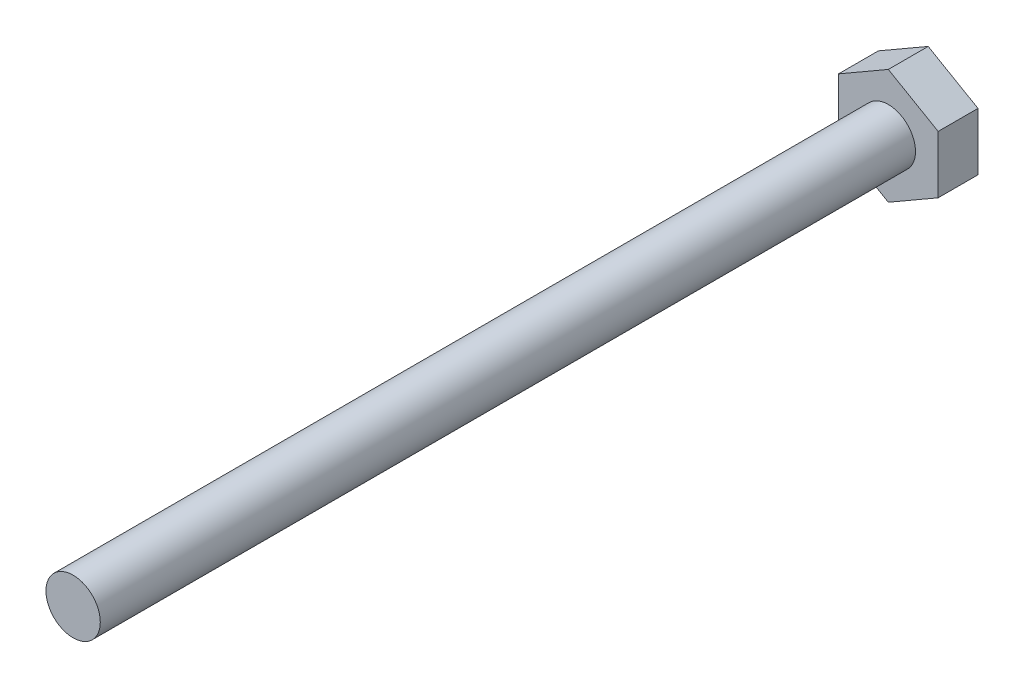
ISO-10303-21;
HEADER;
FILE_DESCRIPTION(('STEP AP214'),'2;1');
FILE_NAME('part.step','',(''),(''),'','','');
FILE_SCHEMA(('AUTOMOTIVE_DESIGN { 1 0 10303 214 1 1 1 1 }'));
ENDSEC;
DATA;
#1=APPLICATION_CONTEXT('core data for automotive mechanical design processes');
#2=APPLICATION_PROTOCOL_DEFINITION('international standard','automotive_design',2000,#1);
#3=PRODUCT_CONTEXT('',#1,'mechanical');
#4=PRODUCT('Part','Part','',(#3));
#5=PRODUCT_RELATED_PRODUCT_CATEGORY('part','',(#4));
#6=PRODUCT_DEFINITION_FORMATION('','',#4);
#7=PRODUCT_DEFINITION_CONTEXT('part definition',#1,'design');
#8=PRODUCT_DEFINITION('design','',#6,#7);
#9=PRODUCT_DEFINITION_SHAPE('','',#8);
#10=(LENGTH_UNIT() NAMED_UNIT(*) SI_UNIT(.MILLI.,.METRE.));
#11=(NAMED_UNIT(*) PLANE_ANGLE_UNIT() SI_UNIT($,.RADIAN.));
#12=(NAMED_UNIT(*) SI_UNIT($,.STERADIAN.) SOLID_ANGLE_UNIT());
#13=UNCERTAINTY_MEASURE_WITH_UNIT(LENGTH_MEASURE(1.E-05),#10,'distance_accuracy_value','');
#14=(GEOMETRIC_REPRESENTATION_CONTEXT(3) GLOBAL_UNCERTAINTY_ASSIGNED_CONTEXT((#13)) GLOBAL_UNIT_ASSIGNED_CONTEXT((#10,
#11,#12)) REPRESENTATION_CONTEXT('',''));
#15=CARTESIAN_POINT('',(0.,0.,0.));
#16=DIRECTION('',(0.,0.,1.));
#17=DIRECTION('',(1.,0.,0.));
#18=AXIS2_PLACEMENT_3D('',#15,#16,#17);
#19=CARTESIAN_POINT('',(-2.75,0.,2.2));
#20=DIRECTION('',(1.,0.,0.));
#21=DIRECTION('',(0.,1.,0.));
#22=AXIS2_PLACEMENT_3D('',#19,#20,#21);
#23=PLANE('',#22);
#24=DIRECTION('',(0.,-1.,0.));
#25=VECTOR('',#24,1.);
#26=CARTESIAN_POINT('',(-2.75,0.,0.));
#27=LINE('',#26,#25);
#28=CARTESIAN_POINT('',(-2.75,1.58771324027147,0.));
#29=VERTEX_POINT('',#28);
#30=CARTESIAN_POINT('',(-2.75,-1.58771324027147,0.));
#31=VERTEX_POINT('',#30);
#32=EDGE_CURVE('E142',#29,#31,#27,.T.);
#33=ORIENTED_EDGE('',*,*,#32,.T.);
#34=DIRECTION('',(0.,0.,-1.));
#35=VECTOR('',#34,1.);
#36=CARTESIAN_POINT('',(-2.75,-1.58771324027147,2.2));
#37=LINE('',#36,#35);
#38=CARTESIAN_POINT('',(-2.75,-1.58771324027147,2.2));
#39=VERTEX_POINT('',#38);
#40=EDGE_CURVE('E171',#39,#31,#37,.T.);
#41=ORIENTED_EDGE('',*,*,#40,.F.);
#42=DIRECTION('',(0.,-1.,0.));
#43=VECTOR('',#42,1.);
#44=CARTESIAN_POINT('',(-2.75,0.,2.2));
#45=LINE('',#44,#43);
#46=CARTESIAN_POINT('',(-2.75,1.58771324027147,2.2));
#47=VERTEX_POINT('',#46);
#48=EDGE_CURVE('E252',#47,#39,#45,.T.);
#49=ORIENTED_EDGE('',*,*,#48,.F.);
#50=DIRECTION('',(0.,0.,-1.));
#51=VECTOR('',#50,1.);
#52=CARTESIAN_POINT('',(-2.75,1.58771324027147,2.2));
#53=LINE('',#52,#51);
#54=EDGE_CURVE('E138',#47,#29,#53,.T.);
#55=ORIENTED_EDGE('',*,*,#54,.T.);
#56=EDGE_LOOP('',(#33,#41,#49,#55));
#57=FACE_BOUND('',#56,.T.);
#58=ADVANCED_FACE('F41',(#57),#23,.F.);
#59=CARTESIAN_POINT('',(-1.375,-2.38156986040721,2.2));
#60=DIRECTION('',(0.5,0.866025403784439,0.));
#61=DIRECTION('',(-0.866025403784439,0.5,0.));
#62=AXIS2_PLACEMENT_3D('',#59,#60,#61);
#63=PLANE('',#62);
#64=DIRECTION('',(0.866025403784439,-0.5,0.));
#65=VECTOR('',#64,1.);
#66=CARTESIAN_POINT('',(-1.375,-2.38156986040721,0.));
#67=LINE('',#66,#65);
#68=CARTESIAN_POINT('',(0.,-3.17542648054294,0.));
#69=VERTEX_POINT('',#68);
#70=EDGE_CURVE('E146',#31,#69,#67,.T.);
#71=ORIENTED_EDGE('',*,*,#70,.T.);
#72=DIRECTION('',(0.,0.,-1.));
#73=VECTOR('',#72,1.);
#74=CARTESIAN_POINT('',(0.,-3.17542648054294,2.2));
#75=LINE('',#74,#73);
#76=CARTESIAN_POINT('',(0.,-3.17542648054294,2.2));
#77=VERTEX_POINT('',#76);
#78=EDGE_CURVE('E167',#77,#69,#75,.T.);
#79=ORIENTED_EDGE('',*,*,#78,.F.);
#80=DIRECTION('',(0.866025403784439,-0.5,0.));
#81=VECTOR('',#80,1.);
#82=CARTESIAN_POINT('',(-1.375,-2.38156986040721,2.2));
#83=LINE('',#82,#81);
#84=EDGE_CURVE('E101',#39,#77,#83,.T.);
#85=ORIENTED_EDGE('',*,*,#84,.F.);
#86=ORIENTED_EDGE('',*,*,#40,.T.);
#87=EDGE_LOOP('',(#71,#79,#85,#86));
#88=FACE_BOUND('',#87,.T.);
#89=ADVANCED_FACE('F259',(#88),#63,.F.);
#90=CARTESIAN_POINT('',(1.375,-2.38156986040721,2.2));
#91=DIRECTION('',(-0.5,0.866025403784439,0.));
#92=DIRECTION('',(-0.866025403784439,-0.5,0.));
#93=AXIS2_PLACEMENT_3D('',#90,#91,#92);
#94=PLANE('',#93);
#95=DIRECTION('',(0.866025403784439,0.5,0.));
#96=VECTOR('',#95,1.);
#97=CARTESIAN_POINT('',(1.375,-2.38156986040721,0.));
#98=LINE('',#97,#96);
#99=CARTESIAN_POINT('',(2.75,-1.58771324027147,0.));
#100=VERTEX_POINT('',#99);
#101=EDGE_CURVE('E150',#69,#100,#98,.T.);
#102=ORIENTED_EDGE('',*,*,#101,.T.);
#103=DIRECTION('',(0.,0.,-1.));
#104=VECTOR('',#103,1.);
#105=CARTESIAN_POINT('',(2.75,-1.58771324027147,2.2));
#106=LINE('',#105,#104);
#107=CARTESIAN_POINT('',(2.75,-1.58771324027147,2.2));
#108=VERTEX_POINT('',#107);
#109=EDGE_CURVE('E131',#108,#100,#106,.T.);
#110=ORIENTED_EDGE('',*,*,#109,.F.);
#111=DIRECTION('',(0.866025403784439,0.5,0.));
#112=VECTOR('',#111,1.);
#113=CARTESIAN_POINT('',(1.375,-2.38156986040721,2.2));
#114=LINE('',#113,#112);
#115=EDGE_CURVE('E117',#77,#108,#114,.T.);
#116=ORIENTED_EDGE('',*,*,#115,.F.);
#117=ORIENTED_EDGE('',*,*,#78,.T.);
#118=EDGE_LOOP('',(#102,#110,#116,#117));
#119=FACE_BOUND('',#118,.T.);
#120=ADVANCED_FACE('F262',(#119),#94,.F.);
#121=CARTESIAN_POINT('',(2.75,0.,2.2));
#122=DIRECTION('',(-1.,0.,0.));
#123=DIRECTION('',(0.,-1.,0.));
#124=AXIS2_PLACEMENT_3D('',#121,#122,#123);
#125=PLANE('',#124);
#126=DIRECTION('',(0.,1.,0.));
#127=VECTOR('',#126,1.);
#128=CARTESIAN_POINT('',(2.75,0.,0.));
#129=LINE('',#128,#127);
#130=CARTESIAN_POINT('',(2.75,1.58771324027147,0.));
#131=VERTEX_POINT('',#130);
#132=EDGE_CURVE('E127',#100,#131,#129,.T.);
#133=ORIENTED_EDGE('',*,*,#132,.T.);
#134=DIRECTION('',(0.,0.,-1.));
#135=VECTOR('',#134,1.);
#136=CARTESIAN_POINT('',(2.75,1.58771324027147,2.2));
#137=LINE('',#136,#135);
#138=CARTESIAN_POINT('',(2.75,1.58771324027147,2.2));
#139=VERTEX_POINT('',#138);
#140=EDGE_CURVE('E124',#139,#131,#137,.T.);
#141=ORIENTED_EDGE('',*,*,#140,.F.);
#142=DIRECTION('',(0.,1.,0.));
#143=VECTOR('',#142,1.);
#144=CARTESIAN_POINT('',(2.75,0.,2.2));
#145=LINE('',#144,#143);
#146=EDGE_CURVE('E110',#108,#139,#145,.T.);
#147=ORIENTED_EDGE('',*,*,#146,.F.);
#148=ORIENTED_EDGE('',*,*,#109,.T.);
#149=EDGE_LOOP('',(#133,#141,#147,#148));
#150=FACE_BOUND('',#149,.T.);
#151=ADVANCED_FACE('F125',(#150),#125,.F.);
#152=CARTESIAN_POINT('',(1.375,2.38156986040721,2.2));
#153=DIRECTION('',(-0.5,-0.866025403784439,0.));
#154=DIRECTION('',(0.866025403784439,-0.5,0.));
#155=AXIS2_PLACEMENT_3D('',#152,#153,#154);
#156=PLANE('',#155);
#157=DIRECTION('',(-0.866025403784439,0.5,0.));
#158=VECTOR('',#157,1.);
#159=CARTESIAN_POINT('',(1.375,2.38156986040721,0.));
#160=LINE('',#159,#158);
#161=CARTESIAN_POINT('',(0.,3.17542648054294,0.));
#162=VERTEX_POINT('',#161);
#163=EDGE_CURVE('E155',#131,#162,#160,.T.);
#164=ORIENTED_EDGE('',*,*,#163,.T.);
#165=DIRECTION('',(0.,0.,-1.));
#166=VECTOR('',#165,1.);
#167=CARTESIAN_POINT('',(0.,3.17542648054294,2.2));
#168=LINE('',#167,#166);
#169=CARTESIAN_POINT('',(0.,3.17542648054294,2.2));
#170=VERTEX_POINT('',#169);
#171=EDGE_CURVE('E132',#170,#162,#168,.T.);
#172=ORIENTED_EDGE('',*,*,#171,.F.);
#173=DIRECTION('',(-0.866025403784439,0.5,0.));
#174=VECTOR('',#173,1.);
#175=CARTESIAN_POINT('',(1.375,2.38156986040721,2.2));
#176=LINE('',#175,#174);
#177=EDGE_CURVE('E114',#139,#170,#176,.T.);
#178=ORIENTED_EDGE('',*,*,#177,.F.);
#179=ORIENTED_EDGE('',*,*,#140,.T.);
#180=EDGE_LOOP('',(#164,#172,#178,#179));
#181=FACE_BOUND('',#180,.T.);
#182=ADVANCED_FACE('F134',(#181),#156,.F.);
#183=CARTESIAN_POINT('',(-1.375,2.38156986040721,2.2));
#184=DIRECTION('',(0.5,-0.866025403784439,0.));
#185=DIRECTION('',(0.866025403784439,0.5,0.));
#186=AXIS2_PLACEMENT_3D('',#183,#184,#185);
#187=PLANE('',#186);
#188=DIRECTION('',(-0.866025403784439,-0.5,0.));
#189=VECTOR('',#188,1.);
#190=CARTESIAN_POINT('',(-1.375,2.38156986040721,0.));
#191=LINE('',#190,#189);
#192=EDGE_CURVE('E92',#162,#29,#191,.T.);
#193=ORIENTED_EDGE('',*,*,#192,.T.);
#194=ORIENTED_EDGE('',*,*,#54,.F.);
#195=DIRECTION('',(-0.866025403784439,-0.5,0.));
#196=VECTOR('',#195,1.);
#197=CARTESIAN_POINT('',(-1.375,2.38156986040721,2.2));
#198=LINE('',#197,#196);
#199=EDGE_CURVE('E65',#170,#47,#198,.T.);
#200=ORIENTED_EDGE('',*,*,#199,.F.);
#201=ORIENTED_EDGE('',*,*,#171,.T.);
#202=EDGE_LOOP('',(#193,#194,#200,#201));
#203=FACE_BOUND('',#202,.T.);
#204=ADVANCED_FACE('F264',(#203),#187,.F.);
#205=CARTESIAN_POINT('',(0.,0.,2.2));
#206=DIRECTION('',(0.,0.,1.));
#207=DIRECTION('',(1.,0.,0.));
#208=AXIS2_PLACEMENT_3D('',#205,#206,#207);
#209=PLANE('',#208);
#210=CARTESIAN_POINT('',(0.,0.,2.2));
#211=DIRECTION('',(0.,0.,1.));
#212=DIRECTION('',(1.,0.,0.));
#213=AXIS2_PLACEMENT_3D('',#210,#211,#212);
#214=CIRCLE('',#213,1.5);
#215=CARTESIAN_POINT('',(1.5,0.,2.2));
#216=VERTEX_POINT('',#215);
#217=EDGE_CURVE('E160',#216,#216,#214,.T.);
#218=ORIENTED_EDGE('',*,*,#217,.F.);
#219=EDGE_LOOP('',(#218));
#220=FACE_BOUND('',#219,.T.);
#221=ORIENTED_EDGE('',*,*,#48,.T.);
#222=ORIENTED_EDGE('',*,*,#84,.T.);
#223=ORIENTED_EDGE('',*,*,#115,.T.);
#224=ORIENTED_EDGE('',*,*,#146,.T.);
#225=ORIENTED_EDGE('',*,*,#177,.T.);
#226=ORIENTED_EDGE('',*,*,#199,.T.);
#227=EDGE_LOOP('',(#221,#222,#223,#224,#225,#226));
#228=FACE_BOUND('',#227,.T.);
#229=ADVANCED_FACE('F112',(#220,#228),#209,.T.);
#230=CARTESIAN_POINT('',(0.,0.,0.));
#231=DIRECTION('',(0.,0.,1.));
#232=DIRECTION('',(1.,0.,0.));
#233=AXIS2_PLACEMENT_3D('',#230,#231,#232);
#234=PLANE('',#233);
#235=DIRECTION('',(0.,1.,0.));
#236=VECTOR('',#235,1.);
#237=CARTESIAN_POINT('',(-0.902887914256968,0.,0.));
#238=LINE('',#237,#236);
#239=CARTESIAN_POINT('',(-0.902887914256968,-0.249002883628349,0.));
#240=VERTEX_POINT('',#239);
#241=CARTESIAN_POINT('',(-0.902887914256968,0.249002883628349,0.));
#242=VERTEX_POINT('',#241);
#243=EDGE_CURVE('E174',#240,#242,#238,.T.);
#244=ORIENTED_EDGE('',*,*,#243,.F.);
#245=DIRECTION('',(1.,0.,0.));
#246=VECTOR('',#245,1.);
#247=CARTESIAN_POINT('',(0.,-0.24900288362835,0.));
#248=LINE('',#247,#246);
#249=CARTESIAN_POINT('',(-0.249002883628348,-0.24900288362835,0.));
#250=VERTEX_POINT('',#249);
#251=EDGE_CURVE('E11',#240,#250,#248,.T.);
#252=ORIENTED_EDGE('',*,*,#251,.T.);
#253=DIRECTION('',(0.,-1.,0.));
#254=VECTOR('',#253,1.);
#255=CARTESIAN_POINT('',(-0.249002883628347,0.,0.));
#256=LINE('',#255,#254);
#257=CARTESIAN_POINT('',(-0.249002883628348,-0.902887914256969,0.));
#258=VERTEX_POINT('',#257);
#259=EDGE_CURVE('E49',#250,#258,#256,.T.);
#260=ORIENTED_EDGE('',*,*,#259,.T.);
#261=DIRECTION('',(1.,0.,0.));
#262=VECTOR('',#261,1.);
#263=CARTESIAN_POINT('',(0.,-0.902887914256969,0.));
#264=LINE('',#263,#262);
#265=CARTESIAN_POINT('',(0.24900288362835,-0.902887914256969,0.));
#266=VERTEX_POINT('',#265);
#267=EDGE_CURVE('E209',#258,#266,#264,.T.);
#268=ORIENTED_EDGE('',*,*,#267,.T.);
#269=DIRECTION('',(0.,-1.,0.));
#270=VECTOR('',#269,1.);
#271=CARTESIAN_POINT('',(0.249002883628349,0.,0.));
#272=LINE('',#271,#270);
#273=CARTESIAN_POINT('',(0.249002883628349,-0.249002883628349,0.));
#274=VERTEX_POINT('',#273);
#275=EDGE_CURVE('E205',#274,#266,#272,.T.);
#276=ORIENTED_EDGE('',*,*,#275,.F.);
#277=DIRECTION('',(-1.,0.,0.));
#278=VECTOR('',#277,1.);
#279=CARTESIAN_POINT('',(0.,-0.24900288362835,0.));
#280=LINE('',#279,#278);
#281=CARTESIAN_POINT('',(0.90288791425697,-0.249002883628349,0.));
#282=VERTEX_POINT('',#281);
#283=EDGE_CURVE('E201',#282,#274,#280,.T.);
#284=ORIENTED_EDGE('',*,*,#283,.F.);
#285=DIRECTION('',(0.,1.,0.));
#286=VECTOR('',#285,1.);
#287=CARTESIAN_POINT('',(0.90288791425697,0.,0.));
#288=LINE('',#287,#286);
#289=CARTESIAN_POINT('',(0.90288791425697,0.249002883628349,0.));
#290=VERTEX_POINT('',#289);
#291=EDGE_CURVE('E197',#282,#290,#288,.T.);
#292=ORIENTED_EDGE('',*,*,#291,.T.);
#293=DIRECTION('',(-1.,0.,0.));
#294=VECTOR('',#293,1.);
#295=CARTESIAN_POINT('',(0.,0.24900288362835,0.));
#296=LINE('',#295,#294);
#297=CARTESIAN_POINT('',(0.249002883628349,0.249002883628349,0.));
#298=VERTEX_POINT('',#297);
#299=EDGE_CURVE('E193',#290,#298,#296,.T.);
#300=ORIENTED_EDGE('',*,*,#299,.T.);
#301=DIRECTION('',(0.,1.,0.));
#302=VECTOR('',#301,1.);
#303=CARTESIAN_POINT('',(0.249002883628349,0.,0.));
#304=LINE('',#303,#302);
#305=CARTESIAN_POINT('',(0.24900288362835,0.902887914256969,0.));
#306=VERTEX_POINT('',#305);
#307=EDGE_CURVE('E189',#298,#306,#304,.T.);
#308=ORIENTED_EDGE('',*,*,#307,.T.);
#309=DIRECTION('',(1.,0.,0.));
#310=VECTOR('',#309,1.);
#311=CARTESIAN_POINT('',(0.,0.902887914256969,0.));
#312=LINE('',#311,#310);
#313=CARTESIAN_POINT('',(-0.249002883628348,0.902887914256969,0.));
#314=VERTEX_POINT('',#313);
#315=EDGE_CURVE('E185',#314,#306,#312,.T.);
#316=ORIENTED_EDGE('',*,*,#315,.F.);
#317=DIRECTION('',(0.,1.,0.));
#318=VECTOR('',#317,1.);
#319=CARTESIAN_POINT('',(-0.249002883628348,0.,0.));
#320=LINE('',#319,#318);
#321=CARTESIAN_POINT('',(-0.249002883628348,0.249002883628349,0.));
#322=VERTEX_POINT('',#321);
#323=EDGE_CURVE('E181',#322,#314,#320,.T.);
#324=ORIENTED_EDGE('',*,*,#323,.F.);
#325=DIRECTION('',(1.,0.,0.));
#326=VECTOR('',#325,1.);
#327=CARTESIAN_POINT('',(0.,0.24900288362835,0.));
#328=LINE('',#327,#326);
#329=EDGE_CURVE('E177',#242,#322,#328,.T.);
#330=ORIENTED_EDGE('',*,*,#329,.F.);
#331=EDGE_LOOP('',(#244,#252,#260,#268,#276,#284,#292,#300,#308,#316,#324,#330));
#332=FACE_BOUND('',#331,.T.);
#333=ORIENTED_EDGE('',*,*,#32,.F.);
#334=ORIENTED_EDGE('',*,*,#192,.F.);
#335=ORIENTED_EDGE('',*,*,#163,.F.);
#336=ORIENTED_EDGE('',*,*,#132,.F.);
#337=ORIENTED_EDGE('',*,*,#101,.F.);
#338=ORIENTED_EDGE('',*,*,#70,.F.);
#339=EDGE_LOOP('',(#333,#334,#335,#336,#337,#338));
#340=FACE_BOUND('',#339,.T.);
#341=ADVANCED_FACE('F218',(#332,#340),#234,.F.);
#342=CARTESIAN_POINT('',(0.,0.,47.2));
#343=DIRECTION('',(0.,0.,-1.));
#344=DIRECTION('',(-1.,0.,0.));
#345=AXIS2_PLACEMENT_3D('',#342,#343,#344);
#346=CYLINDRICAL_SURFACE('',#345,1.5);
#347=ORIENTED_EDGE('',*,*,#217,.T.);
#348=EDGE_LOOP('',(#347));
#349=FACE_BOUND('',#348,.T.);
#350=CARTESIAN_POINT('',(0.,0.,47.2));
#351=DIRECTION('',(0.,0.,1.));
#352=DIRECTION('',(1.,0.,0.));
#353=AXIS2_PLACEMENT_3D('',#350,#351,#352);
#354=CIRCLE('',#353,1.5);
#355=CARTESIAN_POINT('',(1.5,0.,47.2));
#356=VERTEX_POINT('',#355);
#357=EDGE_CURVE('E147',#356,#356,#354,.T.);
#358=ORIENTED_EDGE('',*,*,#357,.F.);
#359=EDGE_LOOP('',(#358));
#360=FACE_BOUND('',#359,.T.);
#361=ADVANCED_FACE('F283',(#349,#360),#346,.T.);
#362=CARTESIAN_POINT('',(0.,0.,47.2));
#363=DIRECTION('',(0.,0.,1.));
#364=DIRECTION('',(1.,0.,0.));
#365=AXIS2_PLACEMENT_3D('',#362,#363,#364);
#366=PLANE('',#365);
#367=ORIENTED_EDGE('',*,*,#357,.T.);
#368=EDGE_LOOP('',(#367));
#369=FACE_BOUND('',#368,.T.);
#370=ADVANCED_FACE('F289',(#369),#366,.T.);
#371=CARTESIAN_POINT('',(0.,-0.24900288362835,1.));
#372=DIRECTION('',(0.,-1.,0.));
#373=DIRECTION('',(1.,0.,0.));
#374=AXIS2_PLACEMENT_3D('',#371,#372,#373);
#375=PLANE('',#374);
#376=DIRECTION('',(0.,0.,-1.));
#377=VECTOR('',#376,1.);
#378=CARTESIAN_POINT('',(-0.902887914256968,-0.249002883628349,1.));
#379=LINE('',#378,#377);
#380=CARTESIAN_POINT('',(-0.902887914256968,-0.249002883628349,1.));
#381=VERTEX_POINT('',#380);
#382=EDGE_CURVE('E56',#381,#240,#379,.T.);
#383=ORIENTED_EDGE('',*,*,#382,.F.);
#384=DIRECTION('',(-1.,0.,0.));
#385=VECTOR('',#384,1.);
#386=CARTESIAN_POINT('',(0.,-0.24900288362835,1.));
#387=LINE('',#386,#385);
#388=CARTESIAN_POINT('',(-0.249002883628348,-0.24900288362835,1.));
#389=VERTEX_POINT('',#388);
#390=EDGE_CURVE('E237',#389,#381,#387,.T.);
#391=ORIENTED_EDGE('',*,*,#390,.F.);
#392=DIRECTION('',(0.,0.,-1.));
#393=VECTOR('',#392,1.);
#394=CARTESIAN_POINT('',(-0.249002883628348,-0.24900288362835,1.));
#395=LINE('',#394,#393);
#396=EDGE_CURVE('E230',#389,#250,#395,.T.);
#397=ORIENTED_EDGE('',*,*,#396,.T.);
#398=ORIENTED_EDGE('',*,*,#251,.F.);
#399=EDGE_LOOP('',(#383,#391,#397,#398));
#400=FACE_BOUND('',#399,.T.);
#401=ADVANCED_FACE('F235',(#400),#375,.F.);
#402=CARTESIAN_POINT('',(-0.249002883628347,0.,1.));
#403=DIRECTION('',(-1.,0.,0.));
#404=DIRECTION('',(0.,-1.,0.));
#405=AXIS2_PLACEMENT_3D('',#402,#403,#404);
#406=PLANE('',#405);
#407=ORIENTED_EDGE('',*,*,#396,.F.);
#408=DIRECTION('',(0.,1.,0.));
#409=VECTOR('',#408,1.);
#410=CARTESIAN_POINT('',(-0.249002883628347,0.,1.));
#411=LINE('',#410,#409);
#412=CARTESIAN_POINT('',(-0.249002883628348,-0.902887914256969,1.));
#413=VERTEX_POINT('',#412);
#414=EDGE_CURVE('E348',#413,#389,#411,.T.);
#415=ORIENTED_EDGE('',*,*,#414,.F.);
#416=DIRECTION('',(0.,0.,-1.));
#417=VECTOR('',#416,1.);
#418=CARTESIAN_POINT('',(-0.249002883628348,-0.902887914256969,1.));
#419=LINE('',#418,#417);
#420=EDGE_CURVE('E233',#413,#258,#419,.T.);
#421=ORIENTED_EDGE('',*,*,#420,.T.);
#422=ORIENTED_EDGE('',*,*,#259,.F.);
#423=EDGE_LOOP('',(#407,#415,#421,#422));
#424=FACE_BOUND('',#423,.T.);
#425=ADVANCED_FACE('F227',(#424),#406,.F.);
#426=CARTESIAN_POINT('',(0.,-0.902887914256969,1.));
#427=DIRECTION('',(0.,-1.,0.));
#428=DIRECTION('',(1.,0.,0.));
#429=AXIS2_PLACEMENT_3D('',#426,#427,#428);
#430=PLANE('',#429);
#431=ORIENTED_EDGE('',*,*,#420,.F.);
#432=DIRECTION('',(-1.,0.,0.));
#433=VECTOR('',#432,1.);
#434=CARTESIAN_POINT('',(0.,-0.902887914256969,1.));
#435=LINE('',#434,#433);
#436=CARTESIAN_POINT('',(0.24900288362835,-0.902887914256969,1.));
#437=VERTEX_POINT('',#436);
#438=EDGE_CURVE('E354',#437,#413,#435,.T.);
#439=ORIENTED_EDGE('',*,*,#438,.F.);
#440=DIRECTION('',(0.,0.,-1.));
#441=VECTOR('',#440,1.);
#442=CARTESIAN_POINT('',(0.24900288362835,-0.902887914256969,1.));
#443=LINE('',#442,#441);
#444=EDGE_CURVE('E245',#437,#266,#443,.T.);
#445=ORIENTED_EDGE('',*,*,#444,.T.);
#446=ORIENTED_EDGE('',*,*,#267,.F.);
#447=EDGE_LOOP('',(#431,#439,#445,#446));
#448=FACE_BOUND('',#447,.T.);
#449=ADVANCED_FACE('F298',(#448),#430,.F.);
#450=CARTESIAN_POINT('',(0.249002883628349,0.,1.));
#451=DIRECTION('',(-1.,0.,0.));
#452=DIRECTION('',(0.,-1.,0.));
#453=AXIS2_PLACEMENT_3D('',#450,#451,#452);
#454=PLANE('',#453);
#455=ORIENTED_EDGE('',*,*,#275,.T.);
#456=ORIENTED_EDGE('',*,*,#444,.F.);
#457=DIRECTION('',(0.,1.,0.));
#458=VECTOR('',#457,1.);
#459=CARTESIAN_POINT('',(0.249002883628349,0.,1.));
#460=LINE('',#459,#458);
#461=CARTESIAN_POINT('',(0.249002883628349,-0.249002883628349,1.));
#462=VERTEX_POINT('',#461);
#463=EDGE_CURVE('E359',#437,#462,#460,.T.);
#464=ORIENTED_EDGE('',*,*,#463,.T.);
#465=DIRECTION('',(0.,0.,-1.));
#466=VECTOR('',#465,1.);
#467=CARTESIAN_POINT('',(0.249002883628349,-0.249002883628349,1.));
#468=LINE('',#467,#466);
#469=EDGE_CURVE('E423',#462,#274,#468,.T.);
#470=ORIENTED_EDGE('',*,*,#469,.T.);
#471=EDGE_LOOP('',(#455,#456,#464,#470));
#472=FACE_BOUND('',#471,.T.);
#473=ADVANCED_FACE('F301',(#472),#454,.T.);
#474=CARTESIAN_POINT('',(0.,-0.24900288362835,1.));
#475=DIRECTION('',(0.,1.,0.));
#476=DIRECTION('',(-1.,0.,0.));
#477=AXIS2_PLACEMENT_3D('',#474,#475,#476);
#478=PLANE('',#477);
#479=ORIENTED_EDGE('',*,*,#283,.T.);
#480=ORIENTED_EDGE('',*,*,#469,.F.);
#481=DIRECTION('',(1.,0.,0.));
#482=VECTOR('',#481,1.);
#483=CARTESIAN_POINT('',(0.,-0.24900288362835,1.));
#484=LINE('',#483,#482);
#485=CARTESIAN_POINT('',(0.90288791425697,-0.249002883628349,1.));
#486=VERTEX_POINT('',#485);
#487=EDGE_CURVE('E363',#462,#486,#484,.T.);
#488=ORIENTED_EDGE('',*,*,#487,.T.);
#489=DIRECTION('',(0.,0.,-1.));
#490=VECTOR('',#489,1.);
#491=CARTESIAN_POINT('',(0.90288791425697,-0.249002883628349,1.));
#492=LINE('',#491,#490);
#493=EDGE_CURVE('E419',#486,#282,#492,.T.);
#494=ORIENTED_EDGE('',*,*,#493,.T.);
#495=EDGE_LOOP('',(#479,#480,#488,#494));
#496=FACE_BOUND('',#495,.T.);
#497=ADVANCED_FACE('F305',(#496),#478,.T.);
#498=CARTESIAN_POINT('',(0.90288791425697,0.,1.));
#499=DIRECTION('',(1.,0.,0.));
#500=DIRECTION('',(0.,0.,-1.));
#501=AXIS2_PLACEMENT_3D('',#498,#499,#500);
#502=PLANE('',#501);
#503=ORIENTED_EDGE('',*,*,#493,.F.);
#504=DIRECTION('',(0.,-1.,0.));
#505=VECTOR('',#504,1.);
#506=CARTESIAN_POINT('',(0.90288791425697,0.,1.));
#507=LINE('',#506,#505);
#508=CARTESIAN_POINT('',(0.90288791425697,0.249002883628349,1.));
#509=VERTEX_POINT('',#508);
#510=EDGE_CURVE('E367',#509,#486,#507,.T.);
#511=ORIENTED_EDGE('',*,*,#510,.F.);
#512=DIRECTION('',(0.,0.,-1.));
#513=VECTOR('',#512,1.);
#514=CARTESIAN_POINT('',(0.90288791425697,0.249002883628349,1.));
#515=LINE('',#514,#513);
#516=EDGE_CURVE('E415',#509,#290,#515,.T.);
#517=ORIENTED_EDGE('',*,*,#516,.T.);
#518=ORIENTED_EDGE('',*,*,#291,.F.);
#519=EDGE_LOOP('',(#503,#511,#517,#518));
#520=FACE_BOUND('',#519,.T.);
#521=ADVANCED_FACE('F309',(#520),#502,.F.);
#522=CARTESIAN_POINT('',(0.,0.24900288362835,1.));
#523=DIRECTION('',(0.,1.,0.));
#524=DIRECTION('',(-1.,0.,0.));
#525=AXIS2_PLACEMENT_3D('',#522,#523,#524);
#526=PLANE('',#525);
#527=ORIENTED_EDGE('',*,*,#516,.F.);
#528=DIRECTION('',(1.,0.,0.));
#529=VECTOR('',#528,1.);
#530=CARTESIAN_POINT('',(0.,0.24900288362835,1.));
#531=LINE('',#530,#529);
#532=CARTESIAN_POINT('',(0.249002883628349,0.249002883628349,1.));
#533=VERTEX_POINT('',#532);
#534=EDGE_CURVE('E371',#533,#509,#531,.T.);
#535=ORIENTED_EDGE('',*,*,#534,.F.);
#536=DIRECTION('',(0.,0.,-1.));
#537=VECTOR('',#536,1.);
#538=CARTESIAN_POINT('',(0.249002883628349,0.249002883628349,1.));
#539=LINE('',#538,#537);
#540=EDGE_CURVE('E411',#533,#298,#539,.T.);
#541=ORIENTED_EDGE('',*,*,#540,.T.);
#542=ORIENTED_EDGE('',*,*,#299,.F.);
#543=EDGE_LOOP('',(#527,#535,#541,#542));
#544=FACE_BOUND('',#543,.T.);
#545=ADVANCED_FACE('F313',(#544),#526,.F.);
#546=CARTESIAN_POINT('',(0.249002883628349,0.,1.));
#547=DIRECTION('',(1.,0.,0.));
#548=DIRECTION('',(0.,1.,0.));
#549=AXIS2_PLACEMENT_3D('',#546,#547,#548);
#550=PLANE('',#549);
#551=ORIENTED_EDGE('',*,*,#540,.F.);
#552=DIRECTION('',(0.,-1.,0.));
#553=VECTOR('',#552,1.);
#554=CARTESIAN_POINT('',(0.249002883628349,0.,1.));
#555=LINE('',#554,#553);
#556=CARTESIAN_POINT('',(0.24900288362835,0.902887914256969,1.));
#557=VERTEX_POINT('',#556);
#558=EDGE_CURVE('E375',#557,#533,#555,.T.);
#559=ORIENTED_EDGE('',*,*,#558,.F.);
#560=DIRECTION('',(0.,0.,-1.));
#561=VECTOR('',#560,1.);
#562=CARTESIAN_POINT('',(0.24900288362835,0.902887914256969,1.));
#563=LINE('',#562,#561);
#564=EDGE_CURVE('E407',#557,#306,#563,.T.);
#565=ORIENTED_EDGE('',*,*,#564,.T.);
#566=ORIENTED_EDGE('',*,*,#307,.F.);
#567=EDGE_LOOP('',(#551,#559,#565,#566));
#568=FACE_BOUND('',#567,.T.);
#569=ADVANCED_FACE('F317',(#568),#550,.F.);
#570=CARTESIAN_POINT('',(0.,0.902887914256969,1.));
#571=DIRECTION('',(0.,-1.,0.));
#572=DIRECTION('',(1.,0.,0.));
#573=AXIS2_PLACEMENT_3D('',#570,#571,#572);
#574=PLANE('',#573);
#575=ORIENTED_EDGE('',*,*,#315,.T.);
#576=ORIENTED_EDGE('',*,*,#564,.F.);
#577=DIRECTION('',(-1.,0.,0.));
#578=VECTOR('',#577,1.);
#579=CARTESIAN_POINT('',(0.,0.902887914256969,1.));
#580=LINE('',#579,#578);
#581=CARTESIAN_POINT('',(-0.249002883628348,0.902887914256969,1.));
#582=VERTEX_POINT('',#581);
#583=EDGE_CURVE('E379',#557,#582,#580,.T.);
#584=ORIENTED_EDGE('',*,*,#583,.T.);
#585=DIRECTION('',(0.,0.,-1.));
#586=VECTOR('',#585,1.);
#587=CARTESIAN_POINT('',(-0.249002883628348,0.902887914256969,1.));
#588=LINE('',#587,#586);
#589=EDGE_CURVE('E403',#582,#314,#588,.T.);
#590=ORIENTED_EDGE('',*,*,#589,.T.);
#591=EDGE_LOOP('',(#575,#576,#584,#590));
#592=FACE_BOUND('',#591,.T.);
#593=ADVANCED_FACE('F321',(#592),#574,.T.);
#594=CARTESIAN_POINT('',(-0.249002883628348,0.,1.));
#595=DIRECTION('',(1.,0.,0.));
#596=DIRECTION('',(0.,1.,0.));
#597=AXIS2_PLACEMENT_3D('',#594,#595,#596);
#598=PLANE('',#597);
#599=ORIENTED_EDGE('',*,*,#323,.T.);
#600=ORIENTED_EDGE('',*,*,#589,.F.);
#601=DIRECTION('',(0.,-1.,0.));
#602=VECTOR('',#601,1.);
#603=CARTESIAN_POINT('',(-0.249002883628348,0.,1.));
#604=LINE('',#603,#602);
#605=CARTESIAN_POINT('',(-0.249002883628348,0.249002883628349,1.));
#606=VERTEX_POINT('',#605);
#607=EDGE_CURVE('E383',#582,#606,#604,.T.);
#608=ORIENTED_EDGE('',*,*,#607,.T.);
#609=DIRECTION('',(0.,0.,-1.));
#610=VECTOR('',#609,1.);
#611=CARTESIAN_POINT('',(-0.249002883628348,0.249002883628349,1.));
#612=LINE('',#611,#610);
#613=EDGE_CURVE('E399',#606,#322,#612,.T.);
#614=ORIENTED_EDGE('',*,*,#613,.T.);
#615=EDGE_LOOP('',(#599,#600,#608,#614));
#616=FACE_BOUND('',#615,.T.);
#617=ADVANCED_FACE('F325',(#616),#598,.T.);
#618=CARTESIAN_POINT('',(0.,0.24900288362835,1.));
#619=DIRECTION('',(0.,-1.,0.));
#620=DIRECTION('',(1.,0.,0.));
#621=AXIS2_PLACEMENT_3D('',#618,#619,#620);
#622=PLANE('',#621);
#623=ORIENTED_EDGE('',*,*,#329,.T.);
#624=ORIENTED_EDGE('',*,*,#613,.F.);
#625=DIRECTION('',(-1.,0.,0.));
#626=VECTOR('',#625,1.);
#627=CARTESIAN_POINT('',(0.,0.24900288362835,1.));
#628=LINE('',#627,#626);
#629=CARTESIAN_POINT('',(-0.902887914256968,0.249002883628349,1.));
#630=VERTEX_POINT('',#629);
#631=EDGE_CURVE('E387',#606,#630,#628,.T.);
#632=ORIENTED_EDGE('',*,*,#631,.T.);
#633=DIRECTION('',(0.,0.,-1.));
#634=VECTOR('',#633,1.);
#635=CARTESIAN_POINT('',(-0.902887914256968,0.249002883628349,1.));
#636=LINE('',#635,#634);
#637=EDGE_CURVE('E395',#630,#242,#636,.T.);
#638=ORIENTED_EDGE('',*,*,#637,.T.);
#639=EDGE_LOOP('',(#623,#624,#632,#638));
#640=FACE_BOUND('',#639,.T.);
#641=ADVANCED_FACE('F329',(#640),#622,.T.);
#642=CARTESIAN_POINT('',(-0.902887914256968,0.,1.));
#643=DIRECTION('',(1.,0.,0.));
#644=DIRECTION('',(0.,0.,-1.));
#645=AXIS2_PLACEMENT_3D('',#642,#643,#644);
#646=PLANE('',#645);
#647=ORIENTED_EDGE('',*,*,#243,.T.);
#648=ORIENTED_EDGE('',*,*,#637,.F.);
#649=DIRECTION('',(0.,-1.,0.));
#650=VECTOR('',#649,1.);
#651=CARTESIAN_POINT('',(-0.902887914256968,0.,1.));
#652=LINE('',#651,#650);
#653=EDGE_CURVE('E346',#630,#381,#652,.T.);
#654=ORIENTED_EDGE('',*,*,#653,.T.);
#655=ORIENTED_EDGE('',*,*,#382,.T.);
#656=EDGE_LOOP('',(#647,#648,#654,#655));
#657=FACE_BOUND('',#656,.T.);
#658=ADVANCED_FACE('F333',(#657),#646,.T.);
#659=CARTESIAN_POINT('',(0.,0.,1.));
#660=DIRECTION('',(0.,0.,1.));
#661=DIRECTION('',(1.,0.,0.));
#662=AXIS2_PLACEMENT_3D('',#659,#660,#661);
#663=PLANE('',#662);
#664=ORIENTED_EDGE('',*,*,#390,.T.);
#665=ORIENTED_EDGE('',*,*,#653,.F.);
#666=ORIENTED_EDGE('',*,*,#631,.F.);
#667=ORIENTED_EDGE('',*,*,#607,.F.);
#668=ORIENTED_EDGE('',*,*,#583,.F.);
#669=ORIENTED_EDGE('',*,*,#558,.T.);
#670=ORIENTED_EDGE('',*,*,#534,.T.);
#671=ORIENTED_EDGE('',*,*,#510,.T.);
#672=ORIENTED_EDGE('',*,*,#487,.F.);
#673=ORIENTED_EDGE('',*,*,#463,.F.);
#674=ORIENTED_EDGE('',*,*,#438,.T.);
#675=ORIENTED_EDGE('',*,*,#414,.T.);
#676=EDGE_LOOP('',(#664,#665,#666,#667,#668,#669,#670,#671,#672,#673,#674,#675));
#677=FACE_BOUND('',#676,.T.);
#678=ADVANCED_FACE('F337',(#677),#663,.F.);
#679=CLOSED_SHELL('',(#58,#89,#120,#151,#182,#204,#229,#341,#361,#370,#401,#425,#449,#473,#497,
#521,#545,#569,#593,#617,#641,#658,#678));
#680=MANIFOLD_SOLID_BREP('B2',#679);
#681=ADVANCED_BREP_SHAPE_REPRESENTATION('',(#18,#680),#14);
#682=SHAPE_DEFINITION_REPRESENTATION(#9,#681);
ENDSEC;
END-ISO-10303-21;
